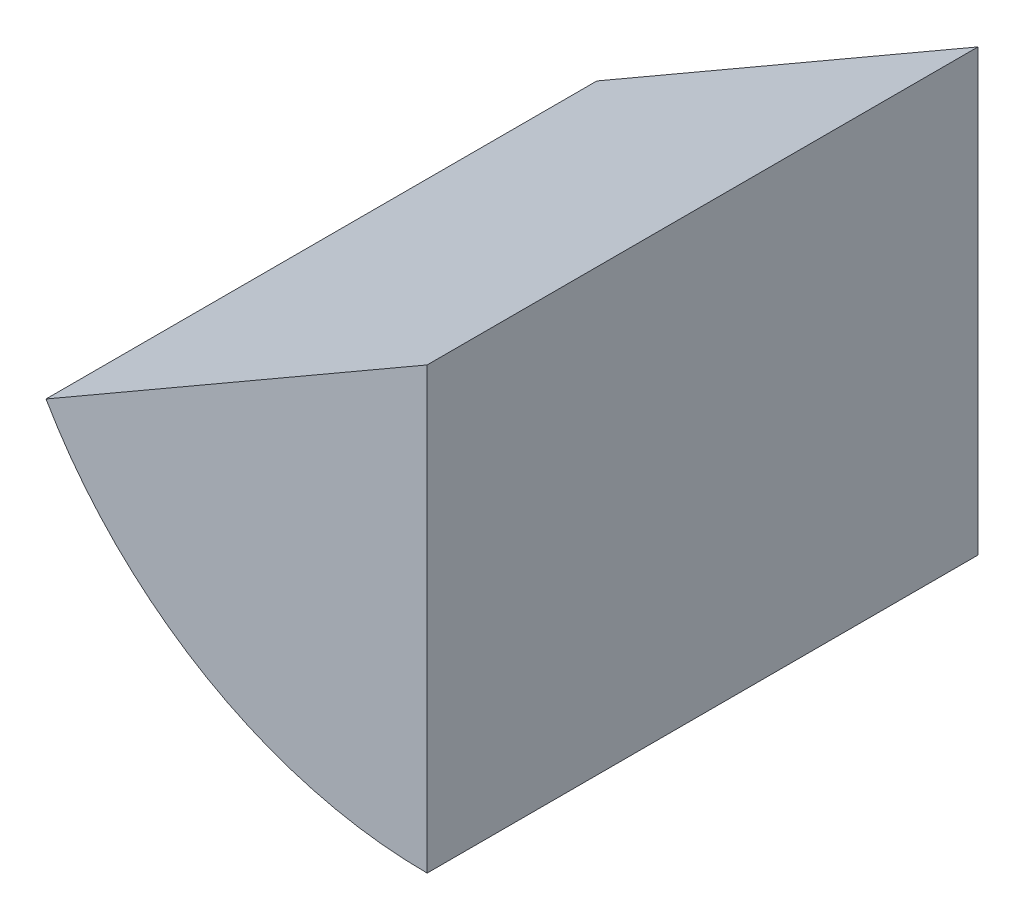
ISO-10303-21;
HEADER;
FILE_DESCRIPTION(('STEP AP214'),'2;1');
FILE_NAME('part.step','',(''),(''),'','','');
FILE_SCHEMA(('AUTOMOTIVE_DESIGN { 1 0 10303 214 1 1 1 1 }'));
ENDSEC;
DATA;
#1=APPLICATION_CONTEXT('core data for automotive mechanical design processes');
#2=APPLICATION_PROTOCOL_DEFINITION('international standard','automotive_design',2000,#1);
#3=PRODUCT_CONTEXT('',#1,'mechanical');
#4=PRODUCT('Part','Part','',(#3));
#5=PRODUCT_RELATED_PRODUCT_CATEGORY('part','',(#4));
#6=PRODUCT_DEFINITION_FORMATION('','',#4);
#7=PRODUCT_DEFINITION_CONTEXT('part definition',#1,'design');
#8=PRODUCT_DEFINITION('design','',#6,#7);
#9=PRODUCT_DEFINITION_SHAPE('','',#8);
#10=(LENGTH_UNIT() NAMED_UNIT(*) SI_UNIT(.MILLI.,.METRE.));
#11=(NAMED_UNIT(*) PLANE_ANGLE_UNIT() SI_UNIT($,.RADIAN.));
#12=(NAMED_UNIT(*) SI_UNIT($,.STERADIAN.) SOLID_ANGLE_UNIT());
#13=UNCERTAINTY_MEASURE_WITH_UNIT(LENGTH_MEASURE(1.E-05),#10,'distance_accuracy_value','');
#14=(GEOMETRIC_REPRESENTATION_CONTEXT(3) GLOBAL_UNCERTAINTY_ASSIGNED_CONTEXT((#13)) GLOBAL_UNIT_ASSIGNED_CONTEXT((#10,
#11,#12)) REPRESENTATION_CONTEXT('',''));
#15=CARTESIAN_POINT('',(0.,0.,0.));
#16=DIRECTION('',(0.,0.,1.));
#17=DIRECTION('',(1.,0.,0.));
#18=AXIS2_PLACEMENT_3D('',#15,#16,#17);
#19=CARTESIAN_POINT('',(0.,0.,50.));
#20=DIRECTION('',(0.499999999999998,-0.86602540378444,0.));
#21=DIRECTION('',(0.86602540378444,0.499999999999998,0.));
#22=AXIS2_PLACEMENT_3D('',#19,#20,#21);
#23=PLANE('',#22);
#24=DIRECTION('',(-0.86602540378444,-0.499999999999998,0.));
#25=VECTOR('',#24,1.);
#26=CARTESIAN_POINT('',(0.,0.,0.));
#27=LINE('',#26,#25);
#28=CARTESIAN_POINT('',(0.,0.,0.));
#29=VERTEX_POINT('',#28);
#30=CARTESIAN_POINT('',(-34.5945990776131,-19.973201089967,0.));
#31=VERTEX_POINT('',#30);
#32=EDGE_CURVE('E80',#29,#31,#27,.T.);
#33=ORIENTED_EDGE('',*,*,#32,.T.);
#34=DIRECTION('',(0.,0.,-1.));
#35=VECTOR('',#34,1.);
#36=CARTESIAN_POINT('',(-34.5945990776131,-19.973201089967,50.));
#37=LINE('',#36,#35);
#38=CARTESIAN_POINT('',(-34.5945990776131,-19.973201089967,50.));
#39=VERTEX_POINT('',#38);
#40=EDGE_CURVE('E11',#39,#31,#37,.T.);
#41=ORIENTED_EDGE('',*,*,#40,.F.);
#42=DIRECTION('',(-0.86602540378444,-0.499999999999998,0.));
#43=VECTOR('',#42,1.);
#44=CARTESIAN_POINT('',(0.,0.,50.));
#45=LINE('',#44,#43);
#46=CARTESIAN_POINT('',(0.,0.,50.));
#47=VERTEX_POINT('',#46);
#48=EDGE_CURVE('E73',#47,#39,#45,.T.);
#49=ORIENTED_EDGE('',*,*,#48,.F.);
#50=DIRECTION('',(0.,0.,-1.));
#51=VECTOR('',#50,1.);
#52=CARTESIAN_POINT('',(0.,0.,50.));
#53=LINE('',#52,#51);
#54=EDGE_CURVE('E81',#47,#29,#53,.T.);
#55=ORIENTED_EDGE('',*,*,#54,.T.);
#56=EDGE_LOOP('',(#33,#41,#49,#55));
#57=FACE_BOUND('',#56,.T.);
#58=ADVANCED_FACE('F33',(#57),#23,.F.);
#59=CARTESIAN_POINT('',(0.,0.,50.));
#60=DIRECTION('',(0.,0.,-1.));
#61=DIRECTION('',(-1.,0.,0.));
#62=AXIS2_PLACEMENT_3D('',#59,#60,#61);
#63=CYLINDRICAL_SURFACE('',#62,39.9464021799342);
#64=CARTESIAN_POINT('',(0.,0.,0.));
#65=DIRECTION('',(0.,0.,1.));
#66=DIRECTION('',(1.,0.,0.));
#67=AXIS2_PLACEMENT_3D('',#64,#65,#66);
#68=CIRCLE('',#67,39.9464021799342);
#69=CARTESIAN_POINT('',(0.,-39.9464021799342,0.));
#70=VERTEX_POINT('',#69);
#71=EDGE_CURVE('E61',#31,#70,#68,.T.);
#72=ORIENTED_EDGE('',*,*,#71,.T.);
#73=DIRECTION('',(0.,0.,-1.));
#74=VECTOR('',#73,1.);
#75=CARTESIAN_POINT('',(0.,-39.9464021799342,50.));
#76=LINE('',#75,#74);
#77=CARTESIAN_POINT('',(0.,-39.9464021799342,50.));
#78=VERTEX_POINT('',#77);
#79=EDGE_CURVE('E41',#78,#70,#76,.T.);
#80=ORIENTED_EDGE('',*,*,#79,.F.);
#81=CARTESIAN_POINT('',(0.,0.,50.));
#82=DIRECTION('',(0.,0.,1.));
#83=DIRECTION('',(1.,0.,0.));
#84=AXIS2_PLACEMENT_3D('',#81,#82,#83);
#85=CIRCLE('',#84,39.9464021799342);
#86=EDGE_CURVE('E69',#39,#78,#85,.T.);
#87=ORIENTED_EDGE('',*,*,#86,.F.);
#88=ORIENTED_EDGE('',*,*,#40,.T.);
#89=EDGE_LOOP('',(#72,#80,#87,#88));
#90=FACE_BOUND('',#89,.T.);
#91=ADVANCED_FACE('F70',(#90),#63,.T.);
#92=CARTESIAN_POINT('',(0.,0.,50.));
#93=DIRECTION('',(-1.,0.,0.));
#94=DIRECTION('',(0.,0.,1.));
#95=AXIS2_PLACEMENT_3D('',#92,#93,#94);
#96=PLANE('',#95);
#97=DIRECTION('',(0.,1.,0.));
#98=VECTOR('',#97,1.);
#99=CARTESIAN_POINT('',(0.,0.,0.));
#100=LINE('',#99,#98);
#101=EDGE_CURVE('E66',#70,#29,#100,.T.);
#102=ORIENTED_EDGE('',*,*,#101,.T.);
#103=ORIENTED_EDGE('',*,*,#54,.F.);
#104=DIRECTION('',(0.,1.,0.));
#105=VECTOR('',#104,1.);
#106=CARTESIAN_POINT('',(0.,0.,50.));
#107=LINE('',#106,#105);
#108=EDGE_CURVE('E49',#78,#47,#107,.T.);
#109=ORIENTED_EDGE('',*,*,#108,.F.);
#110=ORIENTED_EDGE('',*,*,#79,.T.);
#111=EDGE_LOOP('',(#102,#103,#109,#110));
#112=FACE_BOUND('',#111,.T.);
#113=ADVANCED_FACE('F92',(#112),#96,.F.);
#114=CARTESIAN_POINT('',(0.,0.,50.));
#115=DIRECTION('',(0.,0.,1.));
#116=DIRECTION('',(1.,0.,0.));
#117=AXIS2_PLACEMENT_3D('',#114,#115,#116);
#118=PLANE('',#117);
#119=ORIENTED_EDGE('',*,*,#48,.T.);
#120=ORIENTED_EDGE('',*,*,#86,.T.);
#121=ORIENTED_EDGE('',*,*,#108,.T.);
#122=EDGE_LOOP('',(#119,#120,#121));
#123=FACE_BOUND('',#122,.T.);
#124=ADVANCED_FACE('F76',(#123),#118,.T.);
#125=CARTESIAN_POINT('',(0.,0.,0.));
#126=DIRECTION('',(0.,0.,1.));
#127=DIRECTION('',(1.,0.,0.));
#128=AXIS2_PLACEMENT_3D('',#125,#126,#127);
#129=PLANE('',#128);
#130=CARTESIAN_POINT('',(-12.1914905426909,-22.1310132252302,0.));
#131=DIRECTION('',(0.,0.,-1.));
#132=DIRECTION('',(-1.,0.,0.));
#133=AXIS2_PLACEMENT_3D('',#130,#131,#132);
#134=CIRCLE('',#133,5.02190415876299);
#135=CARTESIAN_POINT('',(-17.2133947014538,-22.1310132252302,0.));
#136=VERTEX_POINT('',#135);
#137=EDGE_CURVE('E87',#136,#136,#134,.T.);
#138=ORIENTED_EDGE('',*,*,#137,.F.);
#139=EDGE_LOOP('',(#138));
#140=FACE_BOUND('',#139,.T.);
#141=ORIENTED_EDGE('',*,*,#32,.F.);
#142=ORIENTED_EDGE('',*,*,#101,.F.);
#143=ORIENTED_EDGE('',*,*,#71,.F.);
#144=EDGE_LOOP('',(#141,#142,#143));
#145=FACE_BOUND('',#144,.T.);
#146=ADVANCED_FACE('F93',(#140,#145),#129,.F.);
#147=CARTESIAN_POINT('',(-12.1914905426909,-22.1310132252302,10.));
#148=DIRECTION('',(0.,0.,-1.));
#149=DIRECTION('',(-1.,0.,0.));
#150=AXIS2_PLACEMENT_3D('',#147,#148,#149);
#151=CYLINDRICAL_SURFACE('',#150,5.02190415876299);
#152=CARTESIAN_POINT('',(-12.1914905426909,-22.1310132252302,10.));
#153=DIRECTION('',(0.,0.,-1.));
#154=DIRECTION('',(-1.,0.,0.));
#155=AXIS2_PLACEMENT_3D('',#152,#153,#154);
#156=CIRCLE('',#155,5.02190415876299);
#157=CARTESIAN_POINT('',(-17.2133947014538,-22.1310132252302,10.));
#158=VERTEX_POINT('',#157);
#159=EDGE_CURVE('E83',#158,#158,#156,.T.);
#160=ORIENTED_EDGE('',*,*,#159,.F.);
#161=EDGE_LOOP('',(#160));
#162=FACE_BOUND('',#161,.T.);
#163=ORIENTED_EDGE('',*,*,#137,.T.);
#164=EDGE_LOOP('',(#163));
#165=FACE_BOUND('',#164,.T.);
#166=ADVANCED_FACE('F95',(#162,#165),#151,.F.);
#167=CARTESIAN_POINT('',(-12.1914905426909,-22.1310132252302,10.));
#168=DIRECTION('',(0.,0.,-1.));
#169=DIRECTION('',(-1.,0.,0.));
#170=AXIS2_PLACEMENT_3D('',#167,#168,#169);
#171=PLANE('',#170);
#172=ORIENTED_EDGE('',*,*,#159,.T.);
#173=EDGE_LOOP('',(#172));
#174=FACE_BOUND('',#173,.T.);
#175=ADVANCED_FACE('F102',(#174),#171,.T.);
#176=CLOSED_SHELL('',(#58,#91,#113,#124,#146,#166,#175));
#177=MANIFOLD_SOLID_BREP('B2',#176);
#178=ADVANCED_BREP_SHAPE_REPRESENTATION('',(#18,#177),#14);
#179=SHAPE_DEFINITION_REPRESENTATION(#9,#178);
ENDSEC;
END-ISO-10303-21;
